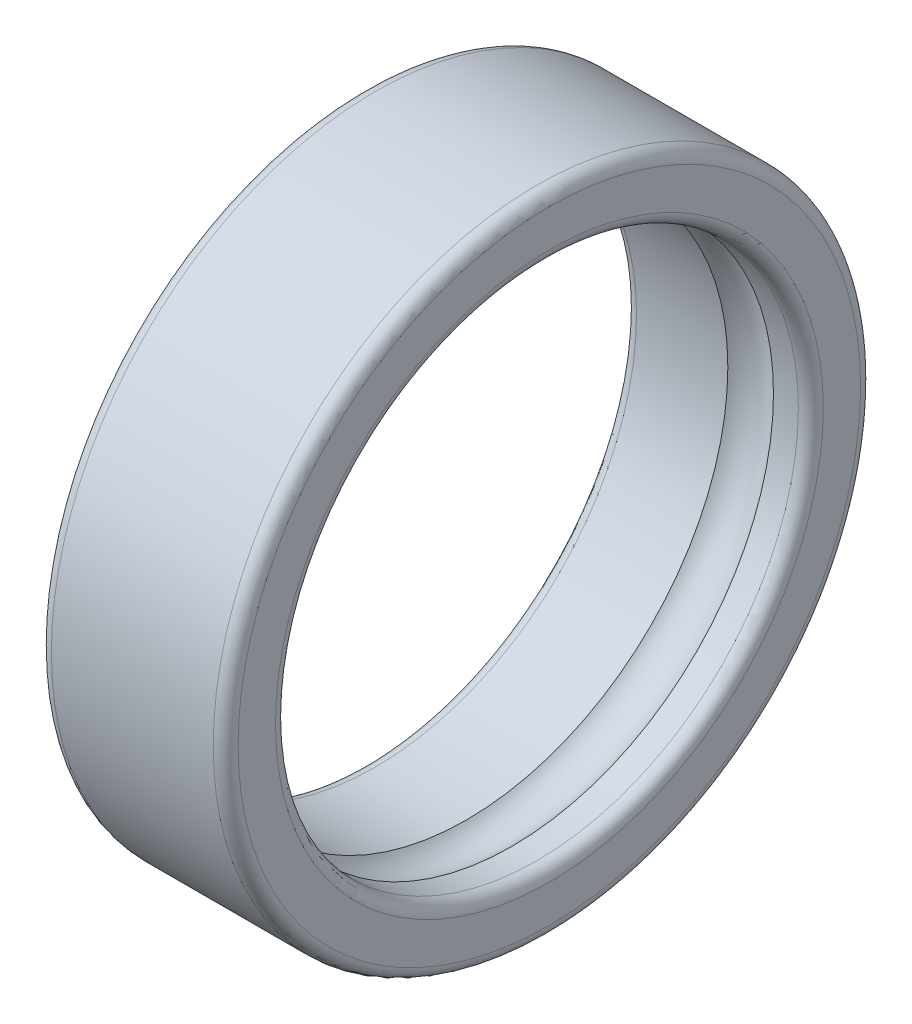
ISO-10303-21;
HEADER;
FILE_DESCRIPTION(('STEP AP214'),'2;1');
FILE_NAME('part.step','',(''),(''),'','','');
FILE_SCHEMA(('AUTOMOTIVE_DESIGN { 1 0 10303 214 1 1 1 1 }'));
ENDSEC;
DATA;
#1=APPLICATION_CONTEXT('core data for automotive mechanical design processes');
#2=APPLICATION_PROTOCOL_DEFINITION('international standard','automotive_design',2000,#1);
#3=PRODUCT_CONTEXT('',#1,'mechanical');
#4=PRODUCT('Part','Part','',(#3));
#5=PRODUCT_RELATED_PRODUCT_CATEGORY('part','',(#4));
#6=PRODUCT_DEFINITION_FORMATION('','',#4);
#7=PRODUCT_DEFINITION_CONTEXT('part definition',#1,'design');
#8=PRODUCT_DEFINITION('design','',#6,#7);
#9=PRODUCT_DEFINITION_SHAPE('','',#8);
#10=(LENGTH_UNIT() NAMED_UNIT(*) SI_UNIT(.MILLI.,.METRE.));
#11=(NAMED_UNIT(*) PLANE_ANGLE_UNIT() SI_UNIT($,.RADIAN.));
#12=(NAMED_UNIT(*) SI_UNIT($,.STERADIAN.) SOLID_ANGLE_UNIT());
#13=UNCERTAINTY_MEASURE_WITH_UNIT(LENGTH_MEASURE(1.E-05),#10,'distance_accuracy_value','');
#14=(GEOMETRIC_REPRESENTATION_CONTEXT(3) GLOBAL_UNCERTAINTY_ASSIGNED_CONTEXT((#13)) GLOBAL_UNIT_ASSIGNED_CONTEXT((#10,
#11,#12)) REPRESENTATION_CONTEXT('',''));
#15=CARTESIAN_POINT('',(0.,0.,0.));
#16=DIRECTION('',(0.,0.,1.));
#17=DIRECTION('',(1.,0.,0.));
#18=AXIS2_PLACEMENT_3D('',#15,#16,#17);
#19=CARTESIAN_POINT('',(2.66696972201766,0.,0.));
#20=DIRECTION('',(-1.,0.,0.));
#21=DIRECTION('',(0.,0.,1.));
#22=AXIS2_PLACEMENT_3D('',#19,#20,#21);
#23=TOROIDAL_SURFACE('',#22,19.3,2.5);
#24=CARTESIAN_POINT('',(4.5,0.,0.));
#25=DIRECTION('',(-1.,0.,0.));
#26=DIRECTION('',(0.,0.,1.));
#27=AXIS2_PLACEMENT_3D('',#24,#25,#26);
#28=CIRCLE('',#27,21.);
#29=CARTESIAN_POINT('',(4.5,0.,21.));
#30=VERTEX_POINT('',#29);
#31=EDGE_CURVE('E10',#30,#30,#28,.T.);
#32=ORIENTED_EDGE('',*,*,#31,.F.);
#33=EDGE_LOOP('',(#32));
#34=FACE_BOUND('',#33,.T.);
#35=CARTESIAN_POINT('',(0.833939444035325,0.,0.));
#36=DIRECTION('',(-1.,0.,0.));
#37=DIRECTION('',(0.,0.,1.));
#38=AXIS2_PLACEMENT_3D('',#35,#36,#37);
#39=CIRCLE('',#38,21.);
#40=CARTESIAN_POINT('',(0.833939444035325,0.,21.));
#41=VERTEX_POINT('',#40);
#42=EDGE_CURVE('E64',#41,#41,#39,.T.);
#43=ORIENTED_EDGE('',*,*,#42,.T.);
#44=EDGE_LOOP('',(#43));
#45=FACE_BOUND('',#44,.T.);
#46=ADVANCED_FACE('F30',(#34,#45),#23,.F.);
#47=CARTESIAN_POINT('',(16.0583409362007,0.,0.));
#48=DIRECTION('',(-1.,0.,0.));
#49=DIRECTION('',(0.,0.,1.));
#50=AXIS2_PLACEMENT_3D('',#47,#48,#49);
#51=CYLINDRICAL_SURFACE('',#50,21.);
#52=CARTESIAN_POINT('',(6.5,0.,0.));
#53=DIRECTION('',(-1.,0.,0.));
#54=DIRECTION('',(0.,0.,1.));
#55=AXIS2_PLACEMENT_3D('',#52,#53,#54);
#56=CIRCLE('',#55,21.);
#57=CARTESIAN_POINT('',(6.5,0.,21.));
#58=VERTEX_POINT('',#57);
#59=EDGE_CURVE('E36',#58,#58,#56,.T.);
#60=ORIENTED_EDGE('',*,*,#59,.F.);
#61=EDGE_LOOP('',(#60));
#62=FACE_BOUND('',#61,.T.);
#63=ORIENTED_EDGE('',*,*,#31,.T.);
#64=EDGE_LOOP('',(#63));
#65=FACE_BOUND('',#64,.T.);
#66=ADVANCED_FACE('F113',(#62,#65),#51,.F.);
#67=CARTESIAN_POINT('',(6.5,0.,0.));
#68=DIRECTION('',(-1.,0.,0.));
#69=DIRECTION('',(0.,0.,1.));
#70=AXIS2_PLACEMENT_3D('',#67,#68,#69);
#71=TOROIDAL_SURFACE('',#70,22.,1.);
#72=CARTESIAN_POINT('',(7.5,0.,0.));
#73=DIRECTION('',(-1.,0.,0.));
#74=DIRECTION('',(0.,0.,1.));
#75=AXIS2_PLACEMENT_3D('',#72,#73,#74);
#76=CIRCLE('',#75,22.);
#77=CARTESIAN_POINT('',(7.5,0.,22.));
#78=VERTEX_POINT('',#77);
#79=EDGE_CURVE('E40',#78,#78,#76,.T.);
#80=ORIENTED_EDGE('',*,*,#79,.F.);
#81=EDGE_LOOP('',(#80));
#82=FACE_BOUND('',#81,.T.);
#83=ORIENTED_EDGE('',*,*,#59,.T.);
#84=EDGE_LOOP('',(#83));
#85=FACE_BOUND('',#84,.T.);
#86=ADVANCED_FACE('F108',(#82,#85),#71,.T.);
#87=CARTESIAN_POINT('',(7.5,25.,0.));
#88=DIRECTION('',(-1.,0.,0.));
#89=DIRECTION('',(0.,0.,1.));
#90=AXIS2_PLACEMENT_3D('',#87,#88,#89);
#91=PLANE('',#90);
#92=CARTESIAN_POINT('',(7.5,0.,0.));
#93=DIRECTION('',(-1.,0.,0.));
#94=DIRECTION('',(0.,0.,1.));
#95=AXIS2_PLACEMENT_3D('',#92,#93,#94);
#96=CIRCLE('',#95,25.);
#97=CARTESIAN_POINT('',(7.5,0.,25.));
#98=VERTEX_POINT('',#97);
#99=EDGE_CURVE('E44',#98,#98,#96,.T.);
#100=ORIENTED_EDGE('',*,*,#99,.F.);
#101=EDGE_LOOP('',(#100));
#102=FACE_BOUND('',#101,.T.);
#103=ORIENTED_EDGE('',*,*,#79,.T.);
#104=EDGE_LOOP('',(#103));
#105=FACE_BOUND('',#104,.T.);
#106=ADVANCED_FACE('F102',(#102,#105),#91,.F.);
#107=CARTESIAN_POINT('',(6.5,0.,0.));
#108=DIRECTION('',(-1.,0.,0.));
#109=DIRECTION('',(0.,0.,1.));
#110=AXIS2_PLACEMENT_3D('',#107,#108,#109);
#111=TOROIDAL_SURFACE('',#110,25.,1.);
#112=CARTESIAN_POINT('',(6.49999999999999,0.,0.));
#113=DIRECTION('',(-1.,0.,0.));
#114=DIRECTION('',(0.,0.,1.));
#115=AXIS2_PLACEMENT_3D('',#112,#113,#114);
#116=CIRCLE('',#115,26.);
#117=CARTESIAN_POINT('',(6.49999999999999,0.,26.));
#118=VERTEX_POINT('',#117);
#119=EDGE_CURVE('E49',#118,#118,#116,.T.);
#120=ORIENTED_EDGE('',*,*,#119,.F.);
#121=EDGE_LOOP('',(#120));
#122=FACE_BOUND('',#121,.T.);
#123=ORIENTED_EDGE('',*,*,#99,.T.);
#124=EDGE_LOOP('',(#123));
#125=FACE_BOUND('',#124,.T.);
#126=ADVANCED_FACE('F96',(#122,#125),#111,.T.);
#127=CARTESIAN_POINT('',(16.0583409362007,0.,0.));
#128=DIRECTION('',(-1.,0.,0.));
#129=DIRECTION('',(0.,0.,1.));
#130=AXIS2_PLACEMENT_3D('',#127,#128,#129);
#131=CYLINDRICAL_SURFACE('',#130,26.);
#132=CARTESIAN_POINT('',(-6.49999999999999,0.,0.));
#133=DIRECTION('',(-1.,0.,0.));
#134=DIRECTION('',(0.,0.,1.));
#135=AXIS2_PLACEMENT_3D('',#132,#133,#134);
#136=CIRCLE('',#135,26.);
#137=CARTESIAN_POINT('',(-6.49999999999999,0.,26.));
#138=VERTEX_POINT('',#137);
#139=EDGE_CURVE('E52',#138,#138,#136,.T.);
#140=ORIENTED_EDGE('',*,*,#139,.F.);
#141=EDGE_LOOP('',(#140));
#142=FACE_BOUND('',#141,.T.);
#143=ORIENTED_EDGE('',*,*,#119,.T.);
#144=EDGE_LOOP('',(#143));
#145=FACE_BOUND('',#144,.T.);
#146=ADVANCED_FACE('F90',(#142,#145),#131,.T.);
#147=CARTESIAN_POINT('',(-6.5,0.,0.));
#148=DIRECTION('',(-1.,0.,0.));
#149=DIRECTION('',(0.,0.,1.));
#150=AXIS2_PLACEMENT_3D('',#147,#148,#149);
#151=TOROIDAL_SURFACE('',#150,25.,1.);
#152=CARTESIAN_POINT('',(-7.5,0.,0.));
#153=DIRECTION('',(-1.,0.,0.));
#154=DIRECTION('',(0.,0.,1.));
#155=AXIS2_PLACEMENT_3D('',#152,#153,#154);
#156=CIRCLE('',#155,25.);
#157=CARTESIAN_POINT('',(-7.5,0.,25.));
#158=VERTEX_POINT('',#157);
#159=EDGE_CURVE('E55',#158,#158,#156,.T.);
#160=ORIENTED_EDGE('',*,*,#159,.F.);
#161=EDGE_LOOP('',(#160));
#162=FACE_BOUND('',#161,.T.);
#163=ORIENTED_EDGE('',*,*,#139,.T.);
#164=EDGE_LOOP('',(#163));
#165=FACE_BOUND('',#164,.T.);
#166=ADVANCED_FACE('F84',(#162,#165),#151,.T.);
#167=CARTESIAN_POINT('',(-7.5,22.,0.));
#168=DIRECTION('',(1.,0.,0.));
#169=DIRECTION('',(0.,0.,-1.));
#170=AXIS2_PLACEMENT_3D('',#167,#168,#169);
#171=PLANE('',#170);
#172=CARTESIAN_POINT('',(-7.5,0.,0.));
#173=DIRECTION('',(-1.,0.,0.));
#174=DIRECTION('',(0.,0.,1.));
#175=AXIS2_PLACEMENT_3D('',#172,#173,#174);
#176=CIRCLE('',#175,22.);
#177=CARTESIAN_POINT('',(-7.5,0.,22.));
#178=VERTEX_POINT('',#177);
#179=EDGE_CURVE('E58',#178,#178,#176,.T.);
#180=ORIENTED_EDGE('',*,*,#179,.F.);
#181=EDGE_LOOP('',(#180));
#182=FACE_BOUND('',#181,.T.);
#183=ORIENTED_EDGE('',*,*,#159,.T.);
#184=EDGE_LOOP('',(#183));
#185=FACE_BOUND('',#184,.T.);
#186=ADVANCED_FACE('F78',(#182,#185),#171,.F.);
#187=CARTESIAN_POINT('',(-6.5,0.,0.));
#188=DIRECTION('',(-1.,0.,0.));
#189=DIRECTION('',(0.,0.,1.));
#190=AXIS2_PLACEMENT_3D('',#187,#188,#189);
#191=TOROIDAL_SURFACE('',#190,22.,1.);
#192=CARTESIAN_POINT('',(-6.5,0.,0.));
#193=DIRECTION('',(-1.,0.,0.));
#194=DIRECTION('',(0.,0.,1.));
#195=AXIS2_PLACEMENT_3D('',#192,#193,#194);
#196=CIRCLE('',#195,21.);
#197=CARTESIAN_POINT('',(-6.5,0.,21.));
#198=VERTEX_POINT('',#197);
#199=EDGE_CURVE('E61',#198,#198,#196,.T.);
#200=ORIENTED_EDGE('',*,*,#199,.F.);
#201=EDGE_LOOP('',(#200));
#202=FACE_BOUND('',#201,.T.);
#203=ORIENTED_EDGE('',*,*,#179,.T.);
#204=EDGE_LOOP('',(#203));
#205=FACE_BOUND('',#204,.T.);
#206=ADVANCED_FACE('F72',(#202,#205),#191,.T.);
#207=CARTESIAN_POINT('',(16.0583409362007,0.,0.));
#208=DIRECTION('',(-1.,0.,0.));
#209=DIRECTION('',(0.,0.,1.));
#210=AXIS2_PLACEMENT_3D('',#207,#208,#209);
#211=CYLINDRICAL_SURFACE('',#210,21.);
#212=ORIENTED_EDGE('',*,*,#42,.F.);
#213=EDGE_LOOP('',(#212));
#214=FACE_BOUND('',#213,.T.);
#215=ORIENTED_EDGE('',*,*,#199,.T.);
#216=EDGE_LOOP('',(#215));
#217=FACE_BOUND('',#216,.T.);
#218=ADVANCED_FACE('F69',(#214,#217),#211,.F.);
#219=CLOSED_SHELL('',(#46,#66,#86,#106,#126,#146,#166,#186,#206,#218));
#220=MANIFOLD_SOLID_BREP('B2',#219);
#221=ADVANCED_BREP_SHAPE_REPRESENTATION('',(#18,#220),#14);
#222=SHAPE_DEFINITION_REPRESENTATION(#9,#221);
ENDSEC;
END-ISO-10303-21;
